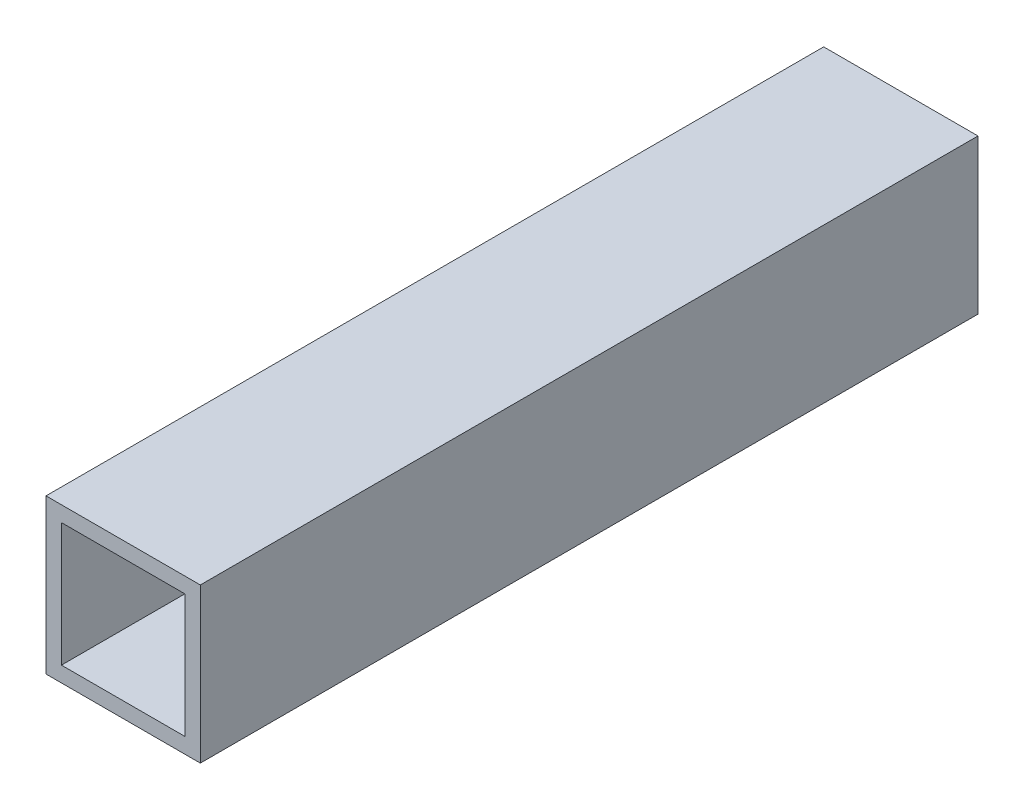
ISO-10303-21;
HEADER;
FILE_DESCRIPTION(('STEP AP214'),'2;1');
FILE_NAME('part.step','',(''),(''),'','','');
FILE_SCHEMA(('AUTOMOTIVE_DESIGN { 1 0 10303 214 1 1 1 1 }'));
ENDSEC;
DATA;
#1=APPLICATION_CONTEXT('core data for automotive mechanical design processes');
#2=APPLICATION_PROTOCOL_DEFINITION('international standard','automotive_design',2000,#1);
#3=PRODUCT_CONTEXT('',#1,'mechanical');
#4=PRODUCT('Part','Part','',(#3));
#5=PRODUCT_RELATED_PRODUCT_CATEGORY('part','',(#4));
#6=PRODUCT_DEFINITION_FORMATION('','',#4);
#7=PRODUCT_DEFINITION_CONTEXT('part definition',#1,'design');
#8=PRODUCT_DEFINITION('design','',#6,#7);
#9=PRODUCT_DEFINITION_SHAPE('','',#8);
#10=(LENGTH_UNIT() NAMED_UNIT(*) SI_UNIT(.MILLI.,.METRE.));
#11=(NAMED_UNIT(*) PLANE_ANGLE_UNIT() SI_UNIT($,.RADIAN.));
#12=(NAMED_UNIT(*) SI_UNIT($,.STERADIAN.) SOLID_ANGLE_UNIT());
#13=UNCERTAINTY_MEASURE_WITH_UNIT(LENGTH_MEASURE(1.E-05),#10,'distance_accuracy_value','');
#14=(GEOMETRIC_REPRESENTATION_CONTEXT(3) GLOBAL_UNCERTAINTY_ASSIGNED_CONTEXT((#13)) GLOBAL_UNIT_ASSIGNED_CONTEXT((#10,
#11,#12)) REPRESENTATION_CONTEXT('',''));
#15=CARTESIAN_POINT('',(0.,0.,0.));
#16=DIRECTION('',(0.,0.,1.));
#17=DIRECTION('',(1.,0.,0.));
#18=AXIS2_PLACEMENT_3D('',#15,#16,#17);
#19=CARTESIAN_POINT('',(1.984375,1.98437499999998,10.));
#20=DIRECTION('',(-1.,0.,0.));
#21=DIRECTION('',(0.,-1.,0.));
#22=AXIS2_PLACEMENT_3D('',#19,#20,#21);
#23=PLANE('',#22);
#24=DIRECTION('',(0.,1.,0.));
#25=VECTOR('',#24,1.);
#26=CARTESIAN_POINT('',(1.984375,1.98437499999998,-10.));
#27=LINE('',#26,#25);
#28=CARTESIAN_POINT('',(1.98437500000001,-1.98437500000002,-10.));
#29=VERTEX_POINT('',#28);
#30=CARTESIAN_POINT('',(1.984375,1.98437499999998,-10.));
#31=VERTEX_POINT('',#30);
#32=EDGE_CURVE('E131',#29,#31,#27,.T.);
#33=ORIENTED_EDGE('',*,*,#32,.T.);
#34=DIRECTION('',(0.,0.,-1.));
#35=VECTOR('',#34,1.);
#36=CARTESIAN_POINT('',(1.984375,1.98437499999998,10.));
#37=LINE('',#36,#35);
#38=CARTESIAN_POINT('',(1.984375,1.98437499999998,10.));
#39=VERTEX_POINT('',#38);
#40=EDGE_CURVE('E11',#39,#31,#37,.T.);
#41=ORIENTED_EDGE('',*,*,#40,.F.);
#42=DIRECTION('',(0.,1.,0.));
#43=VECTOR('',#42,1.);
#44=CARTESIAN_POINT('',(1.984375,1.98437499999998,10.));
#45=LINE('',#44,#43);
#46=CARTESIAN_POINT('',(1.98437500000001,-1.98437500000002,10.));
#47=VERTEX_POINT('',#46);
#48=EDGE_CURVE('E135',#47,#39,#45,.T.);
#49=ORIENTED_EDGE('',*,*,#48,.F.);
#50=DIRECTION('',(0.,0.,-1.));
#51=VECTOR('',#50,1.);
#52=CARTESIAN_POINT('',(1.98437500000001,-1.98437500000002,10.));
#53=LINE('',#52,#51);
#54=EDGE_CURVE('E145',#47,#29,#53,.T.);
#55=ORIENTED_EDGE('',*,*,#54,.T.);
#56=EDGE_LOOP('',(#33,#41,#49,#55));
#57=FACE_BOUND('',#56,.T.);
#58=ADVANCED_FACE('F34',(#57),#23,.F.);
#59=CARTESIAN_POINT('',(-1.98437499999999,1.98437499999998,10.));
#60=DIRECTION('',(0.,-1.,0.));
#61=DIRECTION('',(0.,0.,-1.));
#62=AXIS2_PLACEMENT_3D('',#59,#60,#61);
#63=PLANE('',#62);
#64=DIRECTION('',(-1.,0.,0.));
#65=VECTOR('',#64,1.);
#66=CARTESIAN_POINT('',(-1.98437499999999,1.98437499999998,-10.));
#67=LINE('',#66,#65);
#68=CARTESIAN_POINT('',(-1.98437499999999,1.98437499999998,-10.));
#69=VERTEX_POINT('',#68);
#70=EDGE_CURVE('E148',#31,#69,#67,.T.);
#71=ORIENTED_EDGE('',*,*,#70,.T.);
#72=DIRECTION('',(0.,0.,-1.));
#73=VECTOR('',#72,1.);
#74=CARTESIAN_POINT('',(-1.98437499999999,1.98437499999998,10.));
#75=LINE('',#74,#73);
#76=CARTESIAN_POINT('',(-1.98437499999999,1.98437499999998,10.));
#77=VERTEX_POINT('',#76);
#78=EDGE_CURVE('E41',#77,#69,#75,.T.);
#79=ORIENTED_EDGE('',*,*,#78,.F.);
#80=DIRECTION('',(-1.,0.,0.));
#81=VECTOR('',#80,1.);
#82=CARTESIAN_POINT('',(-1.98437499999999,1.98437499999998,10.));
#83=LINE('',#82,#81);
#84=EDGE_CURVE('E138',#39,#77,#83,.T.);
#85=ORIENTED_EDGE('',*,*,#84,.F.);
#86=ORIENTED_EDGE('',*,*,#40,.T.);
#87=EDGE_LOOP('',(#71,#79,#85,#86));
#88=FACE_BOUND('',#87,.T.);
#89=ADVANCED_FACE('F176',(#88),#63,.F.);
#90=CARTESIAN_POINT('',(-1.98437499999999,1.98437499999998,10.));
#91=DIRECTION('',(1.,0.,0.));
#92=DIRECTION('',(0.,1.,0.));
#93=AXIS2_PLACEMENT_3D('',#90,#91,#92);
#94=PLANE('',#93);
#95=DIRECTION('',(0.,-1.,0.));
#96=VECTOR('',#95,1.);
#97=CARTESIAN_POINT('',(-1.98437499999999,1.98437499999998,-10.));
#98=LINE('',#97,#96);
#99=CARTESIAN_POINT('',(-1.98437499999998,-1.98437500000002,-10.));
#100=VERTEX_POINT('',#99);
#101=EDGE_CURVE('E150',#69,#100,#98,.T.);
#102=ORIENTED_EDGE('',*,*,#101,.T.);
#103=DIRECTION('',(0.,0.,-1.));
#104=VECTOR('',#103,1.);
#105=CARTESIAN_POINT('',(-1.98437499999998,-1.98437500000002,10.));
#106=LINE('',#105,#104);
#107=CARTESIAN_POINT('',(-1.98437499999998,-1.98437500000002,10.));
#108=VERTEX_POINT('',#107);
#109=EDGE_CURVE('E155',#108,#100,#106,.T.);
#110=ORIENTED_EDGE('',*,*,#109,.F.);
#111=DIRECTION('',(0.,-1.,0.));
#112=VECTOR('',#111,1.);
#113=CARTESIAN_POINT('',(-1.98437499999999,1.98437499999998,10.));
#114=LINE('',#113,#112);
#115=EDGE_CURVE('E141',#77,#108,#114,.T.);
#116=ORIENTED_EDGE('',*,*,#115,.F.);
#117=ORIENTED_EDGE('',*,*,#78,.T.);
#118=EDGE_LOOP('',(#102,#110,#116,#117));
#119=FACE_BOUND('',#118,.T.);
#120=ADVANCED_FACE('F162',(#119),#94,.F.);
#121=CARTESIAN_POINT('',(-1.98437499999998,-1.98437500000002,10.));
#122=DIRECTION('',(0.,1.,0.));
#123=DIRECTION('',(0.,0.,1.));
#124=AXIS2_PLACEMENT_3D('',#121,#122,#123);
#125=PLANE('',#124);
#126=DIRECTION('',(1.,0.,0.));
#127=VECTOR('',#126,1.);
#128=CARTESIAN_POINT('',(-1.98437499999998,-1.98437500000002,-10.));
#129=LINE('',#128,#127);
#130=EDGE_CURVE('E139',#100,#29,#129,.T.);
#131=ORIENTED_EDGE('',*,*,#130,.T.);
#132=ORIENTED_EDGE('',*,*,#54,.F.);
#133=DIRECTION('',(1.,0.,0.));
#134=VECTOR('',#133,1.);
#135=CARTESIAN_POINT('',(-1.98437499999998,-1.98437500000002,10.));
#136=LINE('',#135,#134);
#137=EDGE_CURVE('E143',#108,#47,#136,.T.);
#138=ORIENTED_EDGE('',*,*,#137,.F.);
#139=ORIENTED_EDGE('',*,*,#109,.T.);
#140=EDGE_LOOP('',(#131,#132,#138,#139));
#141=FACE_BOUND('',#140,.T.);
#142=ADVANCED_FACE('F169',(#141),#125,.F.);
#143=CARTESIAN_POINT('',(1.98437500000001,-1.98437500000002,10.));
#144=DIRECTION('',(0.,0.,1.));
#145=DIRECTION('',(1.,0.,0.));
#146=AXIS2_PLACEMENT_3D('',#143,#144,#145);
#147=PLANE('',#146);
#148=DIRECTION('',(0.,1.,0.));
#149=VECTOR('',#148,1.);
#150=CARTESIAN_POINT('',(1.5875,1.5875,10.));
#151=LINE('',#150,#149);
#152=CARTESIAN_POINT('',(1.5875,-1.5875,10.));
#153=VERTEX_POINT('',#152);
#154=CARTESIAN_POINT('',(1.5875,1.5875,10.));
#155=VERTEX_POINT('',#154);
#156=EDGE_CURVE('E48',#153,#155,#151,.T.);
#157=ORIENTED_EDGE('',*,*,#156,.F.);
#158=DIRECTION('',(1.,0.,0.));
#159=VECTOR('',#158,1.);
#160=CARTESIAN_POINT('',(-1.5875,-1.5875,10.));
#161=LINE('',#160,#159);
#162=CARTESIAN_POINT('',(-1.5875,-1.5875,10.));
#163=VERTEX_POINT('',#162);
#164=EDGE_CURVE('E116',#163,#153,#161,.T.);
#165=ORIENTED_EDGE('',*,*,#164,.F.);
#166=DIRECTION('',(0.,-1.,0.));
#167=VECTOR('',#166,1.);
#168=CARTESIAN_POINT('',(-1.5875,1.5875,10.));
#169=LINE('',#168,#167);
#170=CARTESIAN_POINT('',(-1.5875,1.5875,10.));
#171=VERTEX_POINT('',#170);
#172=EDGE_CURVE('E119',#171,#163,#169,.T.);
#173=ORIENTED_EDGE('',*,*,#172,.F.);
#174=DIRECTION('',(-1.,0.,0.));
#175=VECTOR('',#174,1.);
#176=CARTESIAN_POINT('',(-1.5875,1.5875,10.));
#177=LINE('',#176,#175);
#178=EDGE_CURVE('E125',#155,#171,#177,.T.);
#179=ORIENTED_EDGE('',*,*,#178,.F.);
#180=EDGE_LOOP('',(#157,#165,#173,#179));
#181=FACE_BOUND('',#180,.T.);
#182=ORIENTED_EDGE('',*,*,#48,.T.);
#183=ORIENTED_EDGE('',*,*,#84,.T.);
#184=ORIENTED_EDGE('',*,*,#115,.T.);
#185=ORIENTED_EDGE('',*,*,#137,.T.);
#186=EDGE_LOOP('',(#182,#183,#184,#185));
#187=FACE_BOUND('',#186,.T.);
#188=ADVANCED_FACE('F175',(#181,#187),#147,.T.);
#189=CARTESIAN_POINT('',(1.98437500000001,-1.98437500000002,-10.));
#190=DIRECTION('',(0.,0.,1.));
#191=DIRECTION('',(1.,0.,0.));
#192=AXIS2_PLACEMENT_3D('',#189,#190,#191);
#193=PLANE('',#192);
#194=DIRECTION('',(1.,0.,0.));
#195=VECTOR('',#194,1.);
#196=CARTESIAN_POINT('',(-1.5875,-1.5875,-10.));
#197=LINE('',#196,#195);
#198=CARTESIAN_POINT('',(-1.5875,-1.5875,-10.));
#199=VERTEX_POINT('',#198);
#200=CARTESIAN_POINT('',(1.5875,-1.5875,-10.));
#201=VERTEX_POINT('',#200);
#202=EDGE_CURVE('E106',#199,#201,#197,.T.);
#203=ORIENTED_EDGE('',*,*,#202,.T.);
#204=DIRECTION('',(0.,1.,0.));
#205=VECTOR('',#204,1.);
#206=CARTESIAN_POINT('',(1.5875,1.5875,-10.));
#207=LINE('',#206,#205);
#208=CARTESIAN_POINT('',(1.5875,1.5875,-10.));
#209=VERTEX_POINT('',#208);
#210=EDGE_CURVE('E100',#201,#209,#207,.T.);
#211=ORIENTED_EDGE('',*,*,#210,.T.);
#212=DIRECTION('',(-1.,0.,0.));
#213=VECTOR('',#212,1.);
#214=CARTESIAN_POINT('',(-1.5875,1.5875,-10.));
#215=LINE('',#214,#213);
#216=CARTESIAN_POINT('',(-1.5875,1.5875,-10.));
#217=VERTEX_POINT('',#216);
#218=EDGE_CURVE('E109',#209,#217,#215,.T.);
#219=ORIENTED_EDGE('',*,*,#218,.T.);
#220=DIRECTION('',(0.,-1.,0.));
#221=VECTOR('',#220,1.);
#222=CARTESIAN_POINT('',(-1.5875,1.5875,-10.));
#223=LINE('',#222,#221);
#224=EDGE_CURVE('E56',#217,#199,#223,.T.);
#225=ORIENTED_EDGE('',*,*,#224,.T.);
#226=EDGE_LOOP('',(#203,#211,#219,#225));
#227=FACE_BOUND('',#226,.T.);
#228=ORIENTED_EDGE('',*,*,#32,.F.);
#229=ORIENTED_EDGE('',*,*,#130,.F.);
#230=ORIENTED_EDGE('',*,*,#101,.F.);
#231=ORIENTED_EDGE('',*,*,#70,.F.);
#232=EDGE_LOOP('',(#228,#229,#230,#231));
#233=FACE_BOUND('',#232,.T.);
#234=ADVANCED_FACE('F113',(#227,#233),#193,.F.);
#235=CARTESIAN_POINT('',(1.5875,1.5875,-10.));
#236=DIRECTION('',(1.,0.,0.));
#237=DIRECTION('',(0.,1.,0.));
#238=AXIS2_PLACEMENT_3D('',#235,#236,#237);
#239=PLANE('',#238);
#240=ORIENTED_EDGE('',*,*,#156,.T.);
#241=DIRECTION('',(0.,0.,1.));
#242=VECTOR('',#241,1.);
#243=CARTESIAN_POINT('',(1.5875,1.5875,-10.));
#244=LINE('',#243,#242);
#245=EDGE_CURVE('E96',#209,#155,#244,.T.);
#246=ORIENTED_EDGE('',*,*,#245,.F.);
#247=ORIENTED_EDGE('',*,*,#210,.F.);
#248=DIRECTION('',(0.,0.,1.));
#249=VECTOR('',#248,1.);
#250=CARTESIAN_POINT('',(1.5875,-1.5875,-10.));
#251=LINE('',#250,#249);
#252=EDGE_CURVE('E129',#201,#153,#251,.T.);
#253=ORIENTED_EDGE('',*,*,#252,.T.);
#254=EDGE_LOOP('',(#240,#246,#247,#253));
#255=FACE_BOUND('',#254,.T.);
#256=ADVANCED_FACE('F98',(#255),#239,.F.);
#257=CARTESIAN_POINT('',(-1.5875,-1.5875,-10.));
#258=DIRECTION('',(0.,-1.,0.));
#259=DIRECTION('',(0.,0.,-1.));
#260=AXIS2_PLACEMENT_3D('',#257,#258,#259);
#261=PLANE('',#260);
#262=ORIENTED_EDGE('',*,*,#164,.T.);
#263=ORIENTED_EDGE('',*,*,#252,.F.);
#264=ORIENTED_EDGE('',*,*,#202,.F.);
#265=DIRECTION('',(0.,0.,1.));
#266=VECTOR('',#265,1.);
#267=CARTESIAN_POINT('',(-1.5875,-1.5875,-10.));
#268=LINE('',#267,#266);
#269=EDGE_CURVE('E132',#199,#163,#268,.T.);
#270=ORIENTED_EDGE('',*,*,#269,.T.);
#271=EDGE_LOOP('',(#262,#263,#264,#270));
#272=FACE_BOUND('',#271,.T.);
#273=ADVANCED_FACE('F193',(#272),#261,.F.);
#274=CARTESIAN_POINT('',(-1.5875,1.5875,-10.));
#275=DIRECTION('',(-1.,0.,0.));
#276=DIRECTION('',(0.,-1.,0.));
#277=AXIS2_PLACEMENT_3D('',#274,#275,#276);
#278=PLANE('',#277);
#279=ORIENTED_EDGE('',*,*,#172,.T.);
#280=ORIENTED_EDGE('',*,*,#269,.F.);
#281=ORIENTED_EDGE('',*,*,#224,.F.);
#282=DIRECTION('',(0.,0.,1.));
#283=VECTOR('',#282,1.);
#284=CARTESIAN_POINT('',(-1.5875,1.5875,-10.));
#285=LINE('',#284,#283);
#286=EDGE_CURVE('E105',#217,#171,#285,.T.);
#287=ORIENTED_EDGE('',*,*,#286,.T.);
#288=EDGE_LOOP('',(#279,#280,#281,#287));
#289=FACE_BOUND('',#288,.T.);
#290=ADVANCED_FACE('F196',(#289),#278,.F.);
#291=CARTESIAN_POINT('',(-1.5875,1.5875,-10.));
#292=DIRECTION('',(0.,1.,0.));
#293=DIRECTION('',(0.,0.,1.));
#294=AXIS2_PLACEMENT_3D('',#291,#292,#293);
#295=PLANE('',#294);
#296=ORIENTED_EDGE('',*,*,#178,.T.);
#297=ORIENTED_EDGE('',*,*,#286,.F.);
#298=ORIENTED_EDGE('',*,*,#218,.F.);
#299=ORIENTED_EDGE('',*,*,#245,.T.);
#300=EDGE_LOOP('',(#296,#297,#298,#299));
#301=FACE_BOUND('',#300,.T.);
#302=ADVANCED_FACE('F110',(#301),#295,.F.);
#303=CLOSED_SHELL('',(#58,#89,#120,#142,#188,#234,#256,#273,#290,#302));
#304=MANIFOLD_SOLID_BREP('B2',#303);
#305=ADVANCED_BREP_SHAPE_REPRESENTATION('',(#18,#304),#14);
#306=SHAPE_DEFINITION_REPRESENTATION(#9,#305);
ENDSEC;
END-ISO-10303-21;
